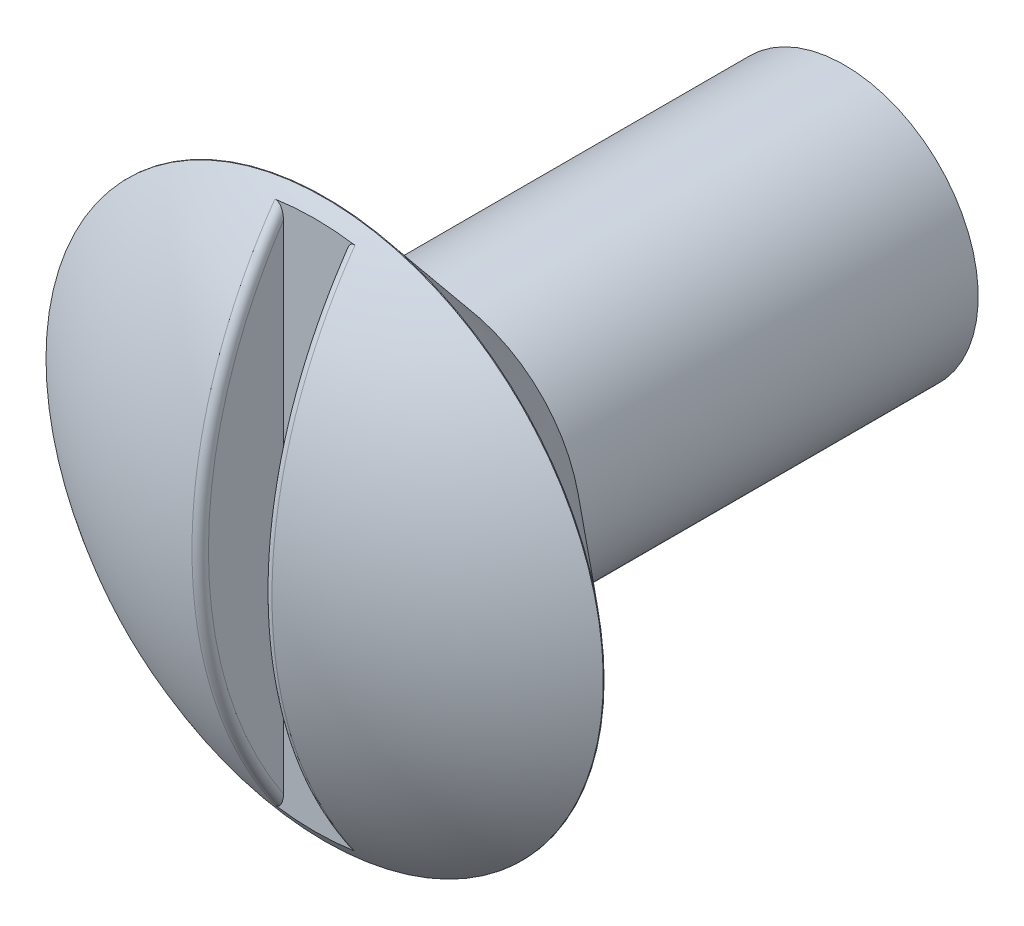
ISO-10303-21;
HEADER;
FILE_DESCRIPTION(('STEP AP214'),'2;1');
FILE_NAME('part.step','',(''),(''),'','','');
FILE_SCHEMA(('AUTOMOTIVE_DESIGN { 1 0 10303 214 1 1 1 1 }'));
ENDSEC;
DATA;
#1=APPLICATION_CONTEXT('core data for automotive mechanical design processes');
#2=APPLICATION_PROTOCOL_DEFINITION('international standard','automotive_design',2000,#1);
#3=PRODUCT_CONTEXT('',#1,'mechanical');
#4=PRODUCT('Part','Part','',(#3));
#5=PRODUCT_RELATED_PRODUCT_CATEGORY('part','',(#4));
#6=PRODUCT_DEFINITION_FORMATION('','',#4);
#7=PRODUCT_DEFINITION_CONTEXT('part definition',#1,'design');
#8=PRODUCT_DEFINITION('design','',#6,#7);
#9=PRODUCT_DEFINITION_SHAPE('','',#8);
#10=(LENGTH_UNIT() NAMED_UNIT(*) SI_UNIT(.MILLI.,.METRE.));
#11=(NAMED_UNIT(*) PLANE_ANGLE_UNIT() SI_UNIT($,.RADIAN.));
#12=(NAMED_UNIT(*) SI_UNIT($,.STERADIAN.) SOLID_ANGLE_UNIT());
#13=UNCERTAINTY_MEASURE_WITH_UNIT(LENGTH_MEASURE(1.E-05),#10,'distance_accuracy_value','');
#14=(GEOMETRIC_REPRESENTATION_CONTEXT(3) GLOBAL_UNCERTAINTY_ASSIGNED_CONTEXT((#13)) GLOBAL_UNIT_ASSIGNED_CONTEXT((#10,
#11,#12)) REPRESENTATION_CONTEXT('',''));
#15=CARTESIAN_POINT('',(0.,0.,0.));
#16=DIRECTION('',(0.,0.,1.));
#17=DIRECTION('',(1.,0.,0.));
#18=AXIS2_PLACEMENT_3D('',#15,#16,#17);
#19=CARTESIAN_POINT('',(0.,0.,-4.6212395375));
#20=DIRECTION('',(0.,0.,1.));
#21=DIRECTION('',(1.,0.,0.));
#22=AXIS2_PLACEMENT_3D('',#19,#20,#21);
#23=SPHERICAL_SURFACE('',#22,5.8312395375);
#24=CARTESIAN_POINT('',(0.,0.,0.01));
#25=DIRECTION('',(0.,0.,1.));
#26=DIRECTION('',(1.,0.,0.));
#27=AXIS2_PLACEMENT_3D('',#24,#25,#26);
#28=CIRCLE('',#27,3.5433);
#29=CARTESIAN_POINT('',(-3.5433,0.,0.01));
#30=VERTEX_POINT('',#29);
#31=EDGE_CURVE('E85',#30,#30,#28,.T.);
#32=ORIENTED_EDGE('',*,*,#31,.T.);
#33=EDGE_LOOP('',(#32));
#34=FACE_BOUND('',#33,.T.);
#35=CARTESIAN_POINT('',(-0.508724116253185,0.,-4.6212395375));
#36=DIRECTION('',(1.,0.,0.));
#37=DIRECTION('',(0.,1.,0.));
#38=AXIS2_PLACEMENT_3D('',#35,#36,#37);
#39=CIRCLE('',#38,5.80900631065638);
#40=CARTESIAN_POINT('',(-0.508724116253186,-3.3366396651448,0.133904));
#41=VERTEX_POINT('',#40);
#42=CARTESIAN_POINT('',(-0.508724116253185,3.3366396651448,0.133904));
#43=VERTEX_POINT('',#42);
#44=EDGE_CURVE('E82',#41,#43,#39,.F.);
#45=ORIENTED_EDGE('',*,*,#44,.T.);
#46=CARTESIAN_POINT('',(0.,0.,0.133904));
#47=DIRECTION('',(0.,0.,1.));
#48=DIRECTION('',(1.,0.,0.));
#49=AXIS2_PLACEMENT_3D('',#46,#47,#48);
#50=CIRCLE('',#49,3.37519843586643);
#51=CARTESIAN_POINT('',(0.508724116253185,3.3366396651448,0.133904));
#52=VERTEX_POINT('',#51);
#53=EDGE_CURVE('E78',#43,#52,#50,.F.);
#54=ORIENTED_EDGE('',*,*,#53,.T.);
#55=CARTESIAN_POINT('',(0.508724116253185,0.,-4.6212395375));
#56=DIRECTION('',(-1.,0.,0.));
#57=DIRECTION('',(0.,-1.,0.));
#58=AXIS2_PLACEMENT_3D('',#55,#56,#57);
#59=CIRCLE('',#58,5.80900631065638);
#60=CARTESIAN_POINT('',(0.508724116253186,-3.3366396651448,0.133904));
#61=VERTEX_POINT('',#60);
#62=EDGE_CURVE('E80',#52,#61,#59,.F.);
#63=ORIENTED_EDGE('',*,*,#62,.T.);
#64=EDGE_CURVE('E84',#61,#41,#50,.F.);
#65=ORIENTED_EDGE('',*,*,#64,.T.);
#66=EDGE_LOOP('',(#45,#54,#63,#65));
#67=FACE_BOUND('',#66,.T.);
#68=ADVANCED_FACE('F32',(#34,#67),#23,.T.);
#69=CARTESIAN_POINT('',(0.,0.,-1.5));
#70=DIRECTION('',(0.,0.,-1.));
#71=DIRECTION('',(-1.,0.,0.));
#72=AXIS2_PLACEMENT_3D('',#69,#70,#71);
#73=PLANE('',#72);
#74=CARTESIAN_POINT('',(0.,0.,-1.5));
#75=DIRECTION('',(0.,0.,-1.));
#76=DIRECTION('',(-1.,0.,0.));
#77=AXIS2_PLACEMENT_3D('',#74,#75,#76);
#78=CIRCLE('',#77,1.75566961110868);
#79=CARTESIAN_POINT('',(-1.75566961110868,0.,-1.5));
#80=VERTEX_POINT('',#79);
#81=EDGE_CURVE('E145',#80,#80,#78,.T.);
#82=ORIENTED_EDGE('',*,*,#81,.T.);
#83=EDGE_LOOP('',(#82));
#84=FACE_BOUND('',#83,.T.);
#85=CARTESIAN_POINT('',(0.,0.,-1.5));
#86=DIRECTION('',(0.,0.,-1.));
#87=DIRECTION('',(-1.,0.,0.));
#88=AXIS2_PLACEMENT_3D('',#85,#86,#87);
#89=CIRCLE('',#88,1.7);
#90=CARTESIAN_POINT('',(-1.7,0.,-1.5));
#91=VERTEX_POINT('',#90);
#92=EDGE_CURVE('E134',#91,#91,#89,.T.);
#93=ORIENTED_EDGE('',*,*,#92,.F.);
#94=EDGE_LOOP('',(#93));
#95=FACE_BOUND('',#94,.T.);
#96=ADVANCED_FACE('F155',(#84,#95),#73,.T.);
#97=CARTESIAN_POINT('',(0.,0.,0.01));
#98=DIRECTION('',(0.,0.,-1.));
#99=DIRECTION('',(-1.,0.,0.));
#100=AXIS2_PLACEMENT_3D('',#97,#98,#99);
#101=CYLINDRICAL_SURFACE('',#100,3.5433);
#102=CARTESIAN_POINT('',(0.,0.,0.));
#103=DIRECTION('',(0.,0.,-1.));
#104=DIRECTION('',(-1.,0.,0.));
#105=AXIS2_PLACEMENT_3D('',#102,#103,#104);
#106=CIRCLE('',#105,3.5433);
#107=CARTESIAN_POINT('',(-3.5433,0.,0.));
#108=VERTEX_POINT('',#107);
#109=EDGE_CURVE('E140',#108,#108,#106,.T.);
#110=CARTESIAN_POINT('',(-3.5433,0.,0.01));
#111=CARTESIAN_POINT('',(-3.5433,0.,0.00989583333333333));
#112=CARTESIAN_POINT('',(-3.5433,0.,0.00979166666666667));
#113=CARTESIAN_POINT('',(-3.5433,0.,0.00958333333333333));
#114=CARTESIAN_POINT('',(-3.5433,0.,0.00947916666666667));
#115=CARTESIAN_POINT('',(-3.5433,0.,0.00927083333333333));
#116=CARTESIAN_POINT('',(-3.5433,0.,0.00916666666666667));
#117=CARTESIAN_POINT('',(-3.5433,0.,0.00895833333333333));
#118=CARTESIAN_POINT('',(-3.5433,0.,0.00885416666666667));
#119=CARTESIAN_POINT('',(-3.5433,0.,0.00864583333333333));
#120=CARTESIAN_POINT('',(-3.5433,0.,0.00854166666666667));
#121=CARTESIAN_POINT('',(-3.5433,0.,0.00833333333333333));
#122=CARTESIAN_POINT('',(-3.5433,0.,0.00822916666666667));
#123=CARTESIAN_POINT('',(-3.5433,0.,0.00802083333333333));
#124=CARTESIAN_POINT('',(-3.5433,0.,0.00791666666666667));
#125=CARTESIAN_POINT('',(-3.5433,0.,0.00770833333333333));
#126=CARTESIAN_POINT('',(-3.5433,0.,0.00760416666666667));
#127=CARTESIAN_POINT('',(-3.5433,0.,0.00739583333333333));
#128=CARTESIAN_POINT('',(-3.5433,0.,0.00729166666666667));
#129=CARTESIAN_POINT('',(-3.5433,0.,0.00708333333333333));
#130=CARTESIAN_POINT('',(-3.5433,0.,0.00697916666666667));
#131=CARTESIAN_POINT('',(-3.5433,0.,0.00677083333333333));
#132=CARTESIAN_POINT('',(-3.5433,0.,0.00666666666666667));
#133=CARTESIAN_POINT('',(-3.5433,0.,0.00645833333333333));
#134=CARTESIAN_POINT('',(-3.5433,0.,0.00635416666666667));
#135=CARTESIAN_POINT('',(-3.5433,0.,0.00614583333333333));
#136=CARTESIAN_POINT('',(-3.5433,0.,0.00604166666666667));
#137=CARTESIAN_POINT('',(-3.5433,0.,0.00583333333333333));
#138=CARTESIAN_POINT('',(-3.5433,0.,0.00572916666666667));
#139=CARTESIAN_POINT('',(-3.5433,0.,0.00552083333333333));
#140=CARTESIAN_POINT('',(-3.5433,0.,0.00541666666666667));
#141=CARTESIAN_POINT('',(-3.5433,0.,0.00520833333333333));
#142=CARTESIAN_POINT('',(-3.5433,0.,0.00510416666666667));
#143=CARTESIAN_POINT('',(-3.5433,0.,0.00489583333333333));
#144=CARTESIAN_POINT('',(-3.5433,0.,0.00479166666666667));
#145=CARTESIAN_POINT('',(-3.5433,0.,0.00458333333333333));
#146=CARTESIAN_POINT('',(-3.5433,0.,0.00447916666666667));
#147=CARTESIAN_POINT('',(-3.5433,0.,0.00427083333333333));
#148=CARTESIAN_POINT('',(-3.5433,0.,0.00416666666666667));
#149=CARTESIAN_POINT('',(-3.5433,0.,0.00395833333333333));
#150=CARTESIAN_POINT('',(-3.5433,0.,0.00385416666666667));
#151=CARTESIAN_POINT('',(-3.5433,0.,0.00364583333333333));
#152=CARTESIAN_POINT('',(-3.5433,0.,0.00354166666666667));
#153=CARTESIAN_POINT('',(-3.5433,0.,0.00333333333333333));
#154=CARTESIAN_POINT('',(-3.5433,0.,0.00322916666666667));
#155=CARTESIAN_POINT('',(-3.5433,0.,0.00302083333333333));
#156=CARTESIAN_POINT('',(-3.5433,0.,0.00291666666666667));
#157=CARTESIAN_POINT('',(-3.5433,0.,0.00270833333333333));
#158=CARTESIAN_POINT('',(-3.5433,0.,0.00260416666666667));
#159=CARTESIAN_POINT('',(-3.5433,0.,0.00239583333333333));
#160=CARTESIAN_POINT('',(-3.5433,0.,0.00229166666666667));
#161=CARTESIAN_POINT('',(-3.5433,0.,0.00208333333333333));
#162=CARTESIAN_POINT('',(-3.5433,0.,0.00197916666666667));
#163=CARTESIAN_POINT('',(-3.5433,0.,0.00177083333333333));
#164=CARTESIAN_POINT('',(-3.5433,0.,0.00166666666666667));
#165=CARTESIAN_POINT('',(-3.5433,0.,0.00145833333333333));
#166=CARTESIAN_POINT('',(-3.5433,0.,0.00135416666666667));
#167=CARTESIAN_POINT('',(-3.5433,0.,0.00114583333333333));
#168=CARTESIAN_POINT('',(-3.5433,0.,0.00104166666666667));
#169=CARTESIAN_POINT('',(-3.5433,0.,0.000833333333333334));
#170=CARTESIAN_POINT('',(-3.5433,0.,0.000729166666666667));
#171=CARTESIAN_POINT('',(-3.5433,0.,0.000520833333333334));
#172=CARTESIAN_POINT('',(-3.5433,0.,0.000416666666666667));
#173=CARTESIAN_POINT('',(-3.5433,0.,0.000208333333333334));
#174=CARTESIAN_POINT('',(-3.5433,0.,0.000104166666666667));
#175=CARTESIAN_POINT('',(-3.5433,0.,0.));
#176=B_SPLINE_CURVE_WITH_KNOTS('',3,(#110,#111,#112,#113,#114,#115,#116,#117,#118,#119,#120,
#121,#122,#123,#124,#125,#126,#127,#128,#129,#130,#131,#132,#133,#134,#135,#136,#137,#138,#139,
#140,#141,#142,#143,#144,#145,#146,#147,#148,#149,#150,#151,#152,#153,#154,#155,#156,#157,#158,
#159,#160,#161,#162,#163,#164,#165,#166,#167,#168,#169,#170,#171,#172,#173,#174,#175),
.UNSPECIFIED.,.F.,.F.,(4,2,2,2,2,2,2,2,2,2,2,2,2,2,2,2,2,2,2,2,2,2,2,2,2,2,2,2,2,2,2,2,4),(0.,
0.000312500000000001,0.000625000000000002,0.000937500000000001,0.00125,0.0015625,0.001875,
0.0021875,0.0025,0.0028125,0.003125,0.0034375,0.00375,0.0040625,0.004375,0.0046875,0.005,
0.0053125,0.005625,0.0059375,0.00625,0.0065625,0.006875,0.0071875,0.0075,0.0078125,0.008125,
0.0084375,0.00875,0.0090625,0.009375,0.0096875,0.01),.UNSPECIFIED.);
#177=EDGE_CURVE('BSEAM151',#30,#108,#176,.T.);
#178=ORIENTED_EDGE('',*,*,#31,.F.);
#179=ORIENTED_EDGE('',*,*,#109,.F.);
#180=ORIENTED_EDGE('',*,*,#177,.T.);
#181=ORIENTED_EDGE('',*,*,#177,.F.);
#182=EDGE_LOOP('',(#178,#180,#179,#181));
#183=FACE_BOUND('',#182,.T.);
#184=ADVANCED_FACE('F151',(#183),#101,.T.);
#185=CARTESIAN_POINT('',(0.,0.,0.));
#186=DIRECTION('',(0.,0.,1.));
#187=DIRECTION('',(-1.,0.,0.));
#188=AXIS2_PLACEMENT_3D('',#185,#186,#187);
#189=CONICAL_SURFACE('',#188,3.5433,0.872664625997167);
#190=ORIENTED_EDGE('',*,*,#81,.F.);
#191=EDGE_LOOP('',(#190));
#192=FACE_BOUND('',#191,.T.);
#193=ORIENTED_EDGE('',*,*,#109,.T.);
#194=EDGE_LOOP('',(#193));
#195=FACE_BOUND('',#194,.T.);
#196=ADVANCED_FACE('F154',(#192,#195),#189,.T.);
#197=CARTESIAN_POINT('',(0.,0.,-6.6));
#198=DIRECTION('',(0.,0.,1.));
#199=DIRECTION('',(1.,0.,0.));
#200=AXIS2_PLACEMENT_3D('',#197,#198,#199);
#201=CYLINDRICAL_SURFACE('',#200,1.7);
#202=CARTESIAN_POINT('',(0.,0.,-6.6));
#203=DIRECTION('',(0.,0.,-1.));
#204=DIRECTION('',(-1.,0.,0.));
#205=AXIS2_PLACEMENT_3D('',#202,#203,#204);
#206=CIRCLE('',#205,1.7);
#207=CARTESIAN_POINT('',(-1.7,0.,-6.6));
#208=VERTEX_POINT('',#207);
#209=EDGE_CURVE('E137',#208,#208,#206,.T.);
#210=ORIENTED_EDGE('',*,*,#209,.F.);
#211=EDGE_LOOP('',(#210));
#212=FACE_BOUND('',#211,.T.);
#213=ORIENTED_EDGE('',*,*,#92,.T.);
#214=EDGE_LOOP('',(#213));
#215=FACE_BOUND('',#214,.T.);
#216=ADVANCED_FACE('F160',(#212,#215),#201,.T.);
#217=CARTESIAN_POINT('',(0.,0.,-6.6));
#218=DIRECTION('',(0.,0.,-1.));
#219=DIRECTION('',(-1.,0.,0.));
#220=AXIS2_PLACEMENT_3D('',#217,#218,#219);
#221=PLANE('',#220);
#222=ORIENTED_EDGE('',*,*,#209,.T.);
#223=EDGE_LOOP('',(#222));
#224=FACE_BOUND('',#223,.T.);
#225=ADVANCED_FACE('F166',(#224),#221,.T.);
#226=CARTESIAN_POINT('',(-0.4,3.8,3.133904));
#227=DIRECTION('',(1.,0.,0.));
#228=DIRECTION('',(0.,1.,0.));
#229=AXIS2_PLACEMENT_3D('',#226,#227,#228);
#230=PLANE('',#229);
#231=DIRECTION('',(0.,-1.,0.));
#232=VECTOR('',#231,1.);
#233=CARTESIAN_POINT('',(-0.4,3.8,0.133904));
#234=LINE('',#233,#232);
#235=CARTESIAN_POINT('',(-0.4,3.16001844519541,0.133903999999998));
#236=VERTEX_POINT('',#235);
#237=CARTESIAN_POINT('',(-0.400000000000001,-3.16001844519541,0.133903999999998));
#238=VERTEX_POINT('',#237);
#239=EDGE_CURVE('E128',#236,#238,#234,.T.);
#240=ORIENTED_EDGE('',*,*,#239,.F.);
#241=CARTESIAN_POINT('',(-0.400000000000001,0.,-4.6212395375));
#242=DIRECTION('',(1.,0.,0.));
#243=DIRECTION('',(0.,1.,0.));
#244=AXIS2_PLACEMENT_3D('',#241,#242,#243);
#245=CIRCLE('',#244,5.70938758854251);
#246=EDGE_CURVE('E92',#236,#238,#245,.T.);
#247=ORIENTED_EDGE('',*,*,#246,.T.);
#248=EDGE_LOOP('',(#240,#247));
#249=FACE_BOUND('',#248,.T.);
#250=ADVANCED_FACE('F132',(#249),#230,.T.);
#251=CARTESIAN_POINT('',(0.4,3.8,3.133904));
#252=DIRECTION('',(-1.,0.,0.));
#253=DIRECTION('',(0.,-1.,0.));
#254=AXIS2_PLACEMENT_3D('',#251,#252,#253);
#255=PLANE('',#254);
#256=DIRECTION('',(0.,1.,0.));
#257=VECTOR('',#256,1.);
#258=CARTESIAN_POINT('',(0.4,3.8,0.133904));
#259=LINE('',#258,#257);
#260=CARTESIAN_POINT('',(0.400000000000001,-3.16001844519541,0.133903999999998));
#261=VERTEX_POINT('',#260);
#262=CARTESIAN_POINT('',(0.4,3.16001844519541,0.133903999999998));
#263=VERTEX_POINT('',#262);
#264=EDGE_CURVE('E89',#261,#263,#259,.T.);
#265=ORIENTED_EDGE('',*,*,#264,.F.);
#266=CARTESIAN_POINT('',(0.400000000000001,0.,-4.6212395375));
#267=DIRECTION('',(-1.,0.,0.));
#268=DIRECTION('',(0.,-1.,0.));
#269=AXIS2_PLACEMENT_3D('',#266,#267,#268);
#270=CIRCLE('',#269,5.70938758854251);
#271=EDGE_CURVE('E52',#261,#263,#270,.T.);
#272=ORIENTED_EDGE('',*,*,#271,.T.);
#273=EDGE_LOOP('',(#265,#272));
#274=FACE_BOUND('',#273,.T.);
#275=ADVANCED_FACE('F115',(#274),#255,.T.);
#276=CARTESIAN_POINT('',(0.,0.,0.133904));
#277=DIRECTION('',(0.,0.,1.));
#278=DIRECTION('',(1.,0.,0.));
#279=AXIS2_PLACEMENT_3D('',#276,#277,#278);
#280=PLANE('',#279);
#281=ORIENTED_EDGE('',*,*,#64,.F.);
#282=CARTESIAN_POINT('',(0.508724116253186,-3.3366396651448,0.133904));
#283=CARTESIAN_POINT('',(0.505036728481897,-3.33721577911082,0.133904));
#284=CARTESIAN_POINT('',(0.501297453566745,-3.33741329989603,0.133904));
#285=CARTESIAN_POINT('',(0.493886666247875,-3.3370926310651,0.133904));
#286=CARTESIAN_POINT('',(0.490214851079807,-3.33658166749706,0.133904));
#287=CARTESIAN_POINT('',(0.483035311242061,-3.33489663132451,0.133904));
#288=CARTESIAN_POINT('',(0.479527372413663,-3.33372345195433,0.133904));
#289=CARTESIAN_POINT('',(0.472746095105065,-3.33082025124605,0.133904));
#290=CARTESIAN_POINT('',(0.469473334233586,-3.32908891260865,0.133904));
#291=CARTESIAN_POINT('',(0.461984285646146,-3.32441977223333,0.133904));
#292=CARTESIAN_POINT('',(0.457897954722038,-3.32127479950792,0.133904));
#293=CARTESIAN_POINT('',(0.450269512098606,-3.31438573760612,0.133904));
#294=CARTESIAN_POINT('',(0.446728598171723,-3.31064036568341,0.133904));
#295=CARTESIAN_POINT('',(0.438167120926359,-3.30035684723972,0.133904));
#296=CARTESIAN_POINT('',(0.433538458732155,-3.29349442358473,0.133904));
#297=CARTESIAN_POINT('',(0.425353841521787,-3.27916253955376,0.133904));
#298=CARTESIAN_POINT('',(0.421800656797519,-3.27169157335751,0.133904));
#299=CARTESIAN_POINT('',(0.413462190188805,-3.25112422479077,0.133904));
#300=CARTESIAN_POINT('',(0.40950937453639,-3.23769169240059,0.133904));
#301=CARTESIAN_POINT('',(0.403661312882824,-3.2104133018058,0.133904));
#302=CARTESIAN_POINT('',(0.401767100139649,-3.19656723962046,0.133904));
#303=CARTESIAN_POINT('',(0.400263967829459,-3.17512369105172,0.133904));
#304=CARTESIAN_POINT('',(0.400005752199982,-3.16756840493587,0.133904));
#305=CARTESIAN_POINT('',(0.400000000000001,-3.16001844519541,0.133904));
#306=B_SPLINE_CURVE_WITH_KNOTS('',3,(#282,#283,#284,#285,#286,#287,#288,#289,#290,#291,#292,
#293,#294,#295,#296,#297,#298,#299,#300,#301,#302,#303,#304,#305),.UNSPECIFIED.,.F.,.F.,(4,2,2,
2,2,2,2,2,2,2,2,4),(0.,0.0111677178986754,0.0222223669018517,0.0332621402762077,
0.0443281614914693,0.0597109301928876,0.0751270131080682,0.0998203022682551,0.124576667219561,
0.166353697528738,0.208151686975776,0.230808519227041),.UNSPECIFIED.);
#307=EDGE_CURVE('E46',#61,#261,#306,.T.);
#308=ORIENTED_EDGE('',*,*,#307,.T.);
#309=ORIENTED_EDGE('',*,*,#264,.T.);
#310=CARTESIAN_POINT('',(0.4,3.16001844519541,0.133904));
#311=CARTESIAN_POINT('',(0.400004486876675,3.16846009831351,0.133904));
#312=CARTESIAN_POINT('',(0.400327863237208,3.1769056017331,0.133904));
#313=CARTESIAN_POINT('',(0.401657247830761,3.19377671620747,0.133904));
#314=CARTESIAN_POINT('',(0.402666031768926,3.20220210604278,0.133904));
#315=CARTESIAN_POINT('',(0.405422749929608,3.21900265380827,0.133904));
#316=CARTESIAN_POINT('',(0.407176542757892,3.22737686810612,0.133904));
#317=CARTESIAN_POINT('',(0.411503059231047,3.24389951497432,0.133904));
#318=CARTESIAN_POINT('',(0.414074189120656,3.25204835367624,0.133904));
#319=CARTESIAN_POINT('',(0.419462478924262,3.2661641159243,0.133904));
#320=CARTESIAN_POINT('',(0.422088595740155,3.27220350674638,0.133904));
#321=CARTESIAN_POINT('',(0.427984231577079,3.28396892248243,0.133904));
#322=CARTESIAN_POINT('',(0.431253966430099,3.28969484145067,0.133904));
#323=CARTESIAN_POINT('',(0.438582475207162,3.30073252812006,0.133904));
#324=CARTESIAN_POINT('',(0.442650793157812,3.30603807241192,0.133904));
#325=CARTESIAN_POINT('',(0.451660783136021,3.31584778688402,0.133904));
#326=CARTESIAN_POINT('',(0.456598725194281,3.32035522100309,0.133904));
#327=CARTESIAN_POINT('',(0.46502660283463,3.32639859200202,0.133904));
#328=CARTESIAN_POINT('',(0.468202814532432,3.32837110435224,0.133904));
#329=CARTESIAN_POINT('',(0.474826029473671,3.331801601828,0.133904));
#330=CARTESIAN_POINT('',(0.478272919094181,3.33325980145078,0.133904));
#331=CARTESIAN_POINT('',(0.485409119950901,3.3355571613799,0.133904));
#332=CARTESIAN_POINT('',(0.489100497405986,3.33639003511409,0.133904));
#333=CARTESIAN_POINT('',(0.496570234833527,3.33732205187179,0.133904));
#334=CARTESIAN_POINT('',(0.500348371630296,3.33742290323236,0.133904));
#335=CARTESIAN_POINT('',(0.505645608639006,3.33704751630822,0.133904));
#336=CARTESIAN_POINT('',(0.507190277630476,3.33687499599142,0.133904));
#337=CARTESIAN_POINT('',(0.508724116253185,3.3366396651448,0.133904));
#338=B_SPLINE_CURVE_WITH_KNOTS('',3,(#310,#311,#312,#313,#314,#315,#316,#317,#318,#319,#320,
#321,#322,#323,#324,#325,#326,#327,#328,#329,#330,#331,#332,#333,#334,#335,#336,#337),
.UNSPECIFIED.,.F.,.F.,(4,2,2,2,2,2,2,2,2,2,2,2,2,4),(0.,0.0253249702978338,0.0507531156466389,
0.0763850366559205,0.101967280507611,0.12169353419498,0.141426414222738,0.161411316770053,
0.181312500372315,0.192492567622908,0.203667966630217,0.214954263641155,0.226214213073415,
0.230871528196598),.UNSPECIFIED.);
#339=EDGE_CURVE('E11',#263,#52,#338,.T.);
#340=ORIENTED_EDGE('',*,*,#339,.T.);
#341=ORIENTED_EDGE('',*,*,#53,.F.);
#342=CARTESIAN_POINT('',(-0.508724116253185,3.3366396651448,0.133904));
#343=CARTESIAN_POINT('',(-0.505036728481896,3.33721577911082,0.133904));
#344=CARTESIAN_POINT('',(-0.501297453566744,3.33741329989603,0.133904));
#345=CARTESIAN_POINT('',(-0.493886666247874,3.3370926310651,0.133904));
#346=CARTESIAN_POINT('',(-0.490214851079807,3.33658166749706,0.133904));
#347=CARTESIAN_POINT('',(-0.483035311242061,3.33489663132451,0.133904));
#348=CARTESIAN_POINT('',(-0.479527372413662,3.33372345195433,0.133904));
#349=CARTESIAN_POINT('',(-0.472746095105064,3.33082025124605,0.133904));
#350=CARTESIAN_POINT('',(-0.469473334233585,3.32908891260865,0.133904));
#351=CARTESIAN_POINT('',(-0.461984285646145,3.32441977223333,0.133904));
#352=CARTESIAN_POINT('',(-0.457897954722036,3.32127479950792,0.133904));
#353=CARTESIAN_POINT('',(-0.450269512098604,3.31438573760612,0.133904));
#354=CARTESIAN_POINT('',(-0.446728598171722,3.31064036568341,0.133904));
#355=CARTESIAN_POINT('',(-0.438167120926359,3.30035684723972,0.133904));
#356=CARTESIAN_POINT('',(-0.433538458732155,3.29349442358473,0.133904));
#357=CARTESIAN_POINT('',(-0.425353841521787,3.27916253955376,0.133904));
#358=CARTESIAN_POINT('',(-0.421800656797519,3.27169157335751,0.133904));
#359=CARTESIAN_POINT('',(-0.413462190188804,3.25112422479077,0.133904));
#360=CARTESIAN_POINT('',(-0.409509374536389,3.23769169240059,0.133904));
#361=CARTESIAN_POINT('',(-0.403661312882822,3.2104133018058,0.133904));
#362=CARTESIAN_POINT('',(-0.401767100139647,3.19656723962046,0.133904));
#363=CARTESIAN_POINT('',(-0.400263967829458,3.17512369105172,0.133904));
#364=CARTESIAN_POINT('',(-0.400005752199981,3.16756840493587,0.133904));
#365=CARTESIAN_POINT('',(-0.4,3.16001844519541,0.133904));
#366=B_SPLINE_CURVE_WITH_KNOTS('',3,(#342,#343,#344,#345,#346,#347,#348,#349,#350,#351,#352,
#353,#354,#355,#356,#357,#358,#359,#360,#361,#362,#363,#364,#365),.UNSPECIFIED.,.F.,.F.,(4,2,2,
2,2,2,2,2,2,2,2,4),(0.,0.0111677178986754,0.0222223669018517,0.0332621402762077,
0.0443281614914693,0.0597109301928879,0.0751270131080683,0.0998203022682544,0.12457666721956,
0.166353697528739,0.208151686975778,0.230808519227041),.UNSPECIFIED.);
#367=EDGE_CURVE('E98',#43,#236,#366,.T.);
#368=ORIENTED_EDGE('',*,*,#367,.T.);
#369=ORIENTED_EDGE('',*,*,#239,.T.);
#370=CARTESIAN_POINT('',(-0.400000000000001,-3.16001844519541,0.133904));
#371=CARTESIAN_POINT('',(-0.400004486876676,-3.16846009831351,0.133904));
#372=CARTESIAN_POINT('',(-0.400327863237208,-3.1769056017331,0.133904));
#373=CARTESIAN_POINT('',(-0.401657247830762,-3.19377671620747,0.133904));
#374=CARTESIAN_POINT('',(-0.402666031768926,-3.20220210604278,0.133904));
#375=CARTESIAN_POINT('',(-0.405422749929608,-3.21900265380827,0.133904));
#376=CARTESIAN_POINT('',(-0.407176542757893,-3.22737686810612,0.133904));
#377=CARTESIAN_POINT('',(-0.411503059231048,-3.24389951497432,0.133904));
#378=CARTESIAN_POINT('',(-0.414074189120657,-3.25204835367624,0.133904));
#379=CARTESIAN_POINT('',(-0.419462478924263,-3.2661641159243,0.133904));
#380=CARTESIAN_POINT('',(-0.422088595740156,-3.27220350674638,0.133904));
#381=CARTESIAN_POINT('',(-0.427984231577079,-3.28396892248243,0.133904));
#382=CARTESIAN_POINT('',(-0.431253966430099,-3.28969484145067,0.133904));
#383=CARTESIAN_POINT('',(-0.438582475207163,-3.30073252812006,0.133904));
#384=CARTESIAN_POINT('',(-0.442650793157813,-3.30603807241192,0.133904));
#385=CARTESIAN_POINT('',(-0.451660783136022,-3.31584778688402,0.133904));
#386=CARTESIAN_POINT('',(-0.456598725194282,-3.32035522100309,0.133904));
#387=CARTESIAN_POINT('',(-0.465026602834631,-3.32639859200202,0.133904));
#388=CARTESIAN_POINT('',(-0.468202814532433,-3.32837110435223,0.133904));
#389=CARTESIAN_POINT('',(-0.474826029473672,-3.33180160182801,0.133904));
#390=CARTESIAN_POINT('',(-0.478272919094181,-3.33325980145078,0.133904));
#391=CARTESIAN_POINT('',(-0.485409119950901,-3.3355571613799,0.133904));
#392=CARTESIAN_POINT('',(-0.489100497405987,-3.33639003511409,0.133904));
#393=CARTESIAN_POINT('',(-0.496570234833529,-3.33732205187179,0.133904));
#394=CARTESIAN_POINT('',(-0.500348371630297,-3.33742290323236,0.133904));
#395=CARTESIAN_POINT('',(-0.505645608639007,-3.33704751630822,0.133904));
#396=CARTESIAN_POINT('',(-0.507190277630477,-3.33687499599142,0.133904));
#397=CARTESIAN_POINT('',(-0.508724116253186,-3.3366396651448,0.133904));
#398=B_SPLINE_CURVE_WITH_KNOTS('',3,(#370,#371,#372,#373,#374,#375,#376,#377,#378,#379,#380,
#381,#382,#383,#384,#385,#386,#387,#388,#389,#390,#391,#392,#393,#394,#395,#396,#397),
.UNSPECIFIED.,.F.,.F.,(4,2,2,2,2,2,2,2,2,2,2,2,2,4),(0.,0.0253249702978334,0.0507531156466381,
0.0763850366559205,0.101967280507611,0.12169353419498,0.141426414222738,0.161411316770053,
0.181312500372314,0.192492567622908,0.203667966630217,0.214954263641155,0.226214213073416,
0.230871528196598),.UNSPECIFIED.);
#399=EDGE_CURVE('E104',#238,#41,#398,.T.);
#400=ORIENTED_EDGE('',*,*,#399,.T.);
#401=EDGE_LOOP('',(#281,#308,#309,#340,#341,#368,#369,#400));
#402=FACE_BOUND('',#401,.T.);
#403=ADVANCED_FACE('F88',(#402),#280,.T.);
#404=CARTESIAN_POINT('',(-0.5,0.,-4.6212395375));
#405=DIRECTION('',(1.,0.,0.));
#406=DIRECTION('',(0.,1.,0.));
#407=AXIS2_PLACEMENT_3D('',#404,#405,#406);
#408=TOROIDAL_SURFACE('',#407,5.70938758854251,0.1);
#409=ORIENTED_EDGE('',*,*,#399,.F.);
#410=ORIENTED_EDGE('',*,*,#246,.F.);
#411=ORIENTED_EDGE('',*,*,#367,.F.);
#412=ORIENTED_EDGE('',*,*,#44,.F.);
#413=EDGE_LOOP('',(#409,#410,#411,#412));
#414=FACE_BOUND('',#413,.T.);
#415=ADVANCED_FACE('F109',(#414),#408,.T.);
#416=CARTESIAN_POINT('',(0.5,0.,-4.6212395375));
#417=DIRECTION('',(-1.,0.,0.));
#418=DIRECTION('',(0.,-1.,0.));
#419=AXIS2_PLACEMENT_3D('',#416,#417,#418);
#420=TOROIDAL_SURFACE('',#419,5.70938758854251,0.1);
#421=ORIENTED_EDGE('',*,*,#339,.F.);
#422=ORIENTED_EDGE('',*,*,#271,.F.);
#423=ORIENTED_EDGE('',*,*,#307,.F.);
#424=ORIENTED_EDGE('',*,*,#62,.F.);
#425=EDGE_LOOP('',(#421,#422,#423,#424));
#426=FACE_BOUND('',#425,.T.);
#427=ADVANCED_FACE('F34',(#426),#420,.T.);
#428=CLOSED_SHELL('',(#68,#96,#184,#196,#216,#225,#250,#275,#403,#415,#427));
#429=MANIFOLD_SOLID_BREP('B2',#428);
#430=ADVANCED_BREP_SHAPE_REPRESENTATION('',(#18,#429),#14);
#431=SHAPE_DEFINITION_REPRESENTATION(#9,#430);
ENDSEC;
END-ISO-10303-21;
